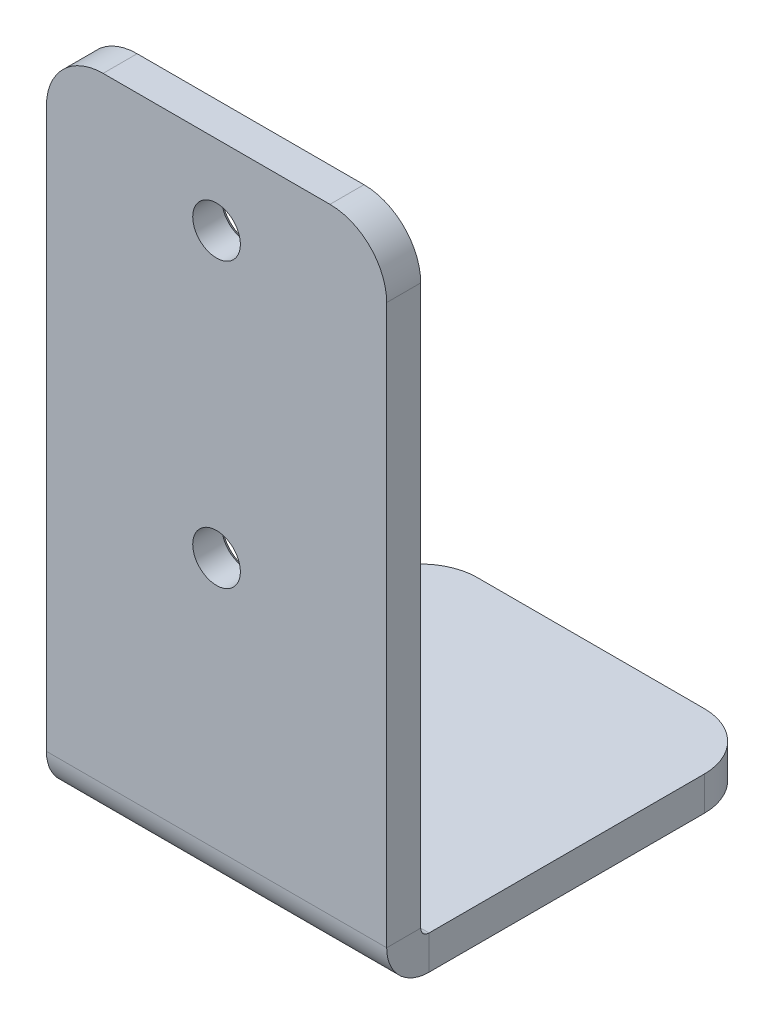
ISO-10303-21;
HEADER;
FILE_DESCRIPTION(('STEP AP214'),'2;1');
FILE_NAME('part.step','',(''),(''),'','','');
FILE_SCHEMA(('AUTOMOTIVE_DESIGN { 1 0 10303 214 1 1 1 1 }'));
ENDSEC;
DATA;
#1=APPLICATION_CONTEXT('core data for automotive mechanical design processes');
#2=APPLICATION_PROTOCOL_DEFINITION('international standard','automotive_design',2000,#1);
#3=PRODUCT_CONTEXT('',#1,'mechanical');
#4=PRODUCT('Part','Part','',(#3));
#5=PRODUCT_RELATED_PRODUCT_CATEGORY('part','',(#4));
#6=PRODUCT_DEFINITION_FORMATION('','',#4);
#7=PRODUCT_DEFINITION_CONTEXT('part definition',#1,'design');
#8=PRODUCT_DEFINITION('design','',#6,#7);
#9=PRODUCT_DEFINITION_SHAPE('','',#8);
#10=(LENGTH_UNIT() NAMED_UNIT(*) SI_UNIT(.MILLI.,.METRE.));
#11=(NAMED_UNIT(*) PLANE_ANGLE_UNIT() SI_UNIT($,.RADIAN.));
#12=(NAMED_UNIT(*) SI_UNIT($,.STERADIAN.) SOLID_ANGLE_UNIT());
#13=UNCERTAINTY_MEASURE_WITH_UNIT(LENGTH_MEASURE(1.E-05),#10,'distance_accuracy_value','');
#14=(GEOMETRIC_REPRESENTATION_CONTEXT(3) GLOBAL_UNCERTAINTY_ASSIGNED_CONTEXT((#13)) GLOBAL_UNIT_ASSIGNED_CONTEXT((#10,
#11,#12)) REPRESENTATION_CONTEXT('',''));
#15=CARTESIAN_POINT('',(0.,0.,0.));
#16=DIRECTION('',(0.,0.,1.));
#17=DIRECTION('',(1.,0.,0.));
#18=AXIS2_PLACEMENT_3D('',#15,#16,#17);
#19=CARTESIAN_POINT('',(15.,-55.,-0.7366));
#20=DIRECTION('',(1.,0.,0.));
#21=DIRECTION('',(0.,0.,-1.));
#22=AXIS2_PLACEMENT_3D('',#19,#20,#21);
#23=PLANE('',#22);
#24=DIRECTION('',(0.,-1.,0.));
#25=VECTOR('',#24,1.);
#26=CARTESIAN_POINT('',(15.,-55.,-0.7366));
#27=LINE('',#26,#25);
#28=CARTESIAN_POINT('',(15.,-55.,-0.7366));
#29=VERTEX_POINT('',#28);
#30=CARTESIAN_POINT('',(15.,-58.,-0.7366));
#31=VERTEX_POINT('',#30);
#32=EDGE_CURVE('E132',#29,#31,#27,.T.);
#33=ORIENTED_EDGE('',*,*,#32,.F.);
#34=CARTESIAN_POINT('',(15.,-54.2634,-0.7366));
#35=DIRECTION('',(-1.,0.,0.));
#36=DIRECTION('',(0.,0.,1.));
#37=AXIS2_PLACEMENT_3D('',#34,#35,#36);
#38=CIRCLE('',#37,0.7366);
#39=CARTESIAN_POINT('',(15.,-54.2634,0.));
#40=VERTEX_POINT('',#39);
#41=EDGE_CURVE('E136',#40,#29,#38,.F.);
#42=ORIENTED_EDGE('',*,*,#41,.F.);
#43=DIRECTION('',(0.,0.,-1.));
#44=VECTOR('',#43,1.);
#45=CARTESIAN_POINT('',(15.,-54.2634,3.));
#46=LINE('',#45,#44);
#47=CARTESIAN_POINT('',(15.,-54.2634,3.));
#48=VERTEX_POINT('',#47);
#49=EDGE_CURVE('E144',#48,#40,#46,.T.);
#50=ORIENTED_EDGE('',*,*,#49,.F.);
#51=CARTESIAN_POINT('',(15.,-54.2634,-0.7366));
#52=DIRECTION('',(1.,0.,0.));
#53=DIRECTION('',(0.,0.,-1.));
#54=AXIS2_PLACEMENT_3D('',#51,#52,#53);
#55=CIRCLE('',#54,3.7366);
#56=EDGE_CURVE('E138',#48,#31,#55,.T.);
#57=ORIENTED_EDGE('',*,*,#56,.T.);
#58=EDGE_LOOP('',(#33,#42,#50,#57));
#59=FACE_BOUND('',#58,.T.);
#60=ADVANCED_FACE('F41',(#59),#23,.T.);
#61=CARTESIAN_POINT('',(15.,-54.2634,3.));
#62=DIRECTION('',(1.,0.,0.));
#63=DIRECTION('',(0.,0.,-1.));
#64=AXIS2_PLACEMENT_3D('',#61,#62,#63);
#65=PLANE('',#64);
#66=DIRECTION('',(0.,0.,-1.));
#67=VECTOR('',#66,1.);
#68=CARTESIAN_POINT('',(15.,-58.,0.));
#69=LINE('',#68,#67);
#70=CARTESIAN_POINT('',(15.,-58.,-25.));
#71=VERTEX_POINT('',#70);
#72=EDGE_CURVE('E166',#31,#71,#69,.T.);
#73=ORIENTED_EDGE('',*,*,#72,.T.);
#74=DIRECTION('',(0.,-1.,0.));
#75=VECTOR('',#74,1.);
#76=CARTESIAN_POINT('',(15.,-54.2634,-25.));
#77=LINE('',#76,#75);
#78=CARTESIAN_POINT('',(15.,-55.,-25.));
#79=VERTEX_POINT('',#78);
#80=EDGE_CURVE('E165',#71,#79,#77,.F.);
#81=ORIENTED_EDGE('',*,*,#80,.T.);
#82=DIRECTION('',(0.,0.,-1.));
#83=VECTOR('',#82,1.);
#84=CARTESIAN_POINT('',(15.,-55.,0.));
#85=LINE('',#84,#83);
#86=EDGE_CURVE('E153',#29,#79,#85,.T.);
#87=ORIENTED_EDGE('',*,*,#86,.F.);
#88=ORIENTED_EDGE('',*,*,#32,.T.);
#89=EDGE_LOOP('',(#73,#81,#87,#88));
#90=FACE_BOUND('',#89,.T.);
#91=ADVANCED_FACE('F163',(#90),#65,.T.);
#92=CARTESIAN_POINT('',(-15.,-54.2634,0.));
#93=DIRECTION('',(-1.,0.,0.));
#94=DIRECTION('',(0.,0.,1.));
#95=AXIS2_PLACEMENT_3D('',#92,#93,#94);
#96=PLANE('',#95);
#97=DIRECTION('',(0.,0.,1.));
#98=VECTOR('',#97,1.);
#99=CARTESIAN_POINT('',(-15.,-54.2634,0.));
#100=LINE('',#99,#98);
#101=CARTESIAN_POINT('',(-15.,-54.2634,0.));
#102=VERTEX_POINT('',#101);
#103=CARTESIAN_POINT('',(-15.,-54.2634,3.));
#104=VERTEX_POINT('',#103);
#105=EDGE_CURVE('E211',#102,#104,#100,.T.);
#106=ORIENTED_EDGE('',*,*,#105,.F.);
#107=CARTESIAN_POINT('',(-15.,-54.2634,-0.7366));
#108=DIRECTION('',(-1.,0.,0.));
#109=DIRECTION('',(0.,0.,1.));
#110=AXIS2_PLACEMENT_3D('',#107,#108,#109);
#111=CIRCLE('',#110,0.7366);
#112=CARTESIAN_POINT('',(-15.,-55.,-0.7366));
#113=VERTEX_POINT('',#112);
#114=EDGE_CURVE('E185',#102,#113,#111,.F.);
#115=ORIENTED_EDGE('',*,*,#114,.T.);
#116=DIRECTION('',(0.,1.,0.));
#117=VECTOR('',#116,1.);
#118=CARTESIAN_POINT('',(-15.,-58.,-0.7366));
#119=LINE('',#118,#117);
#120=CARTESIAN_POINT('',(-15.,-58.,-0.7366));
#121=VERTEX_POINT('',#120);
#122=EDGE_CURVE('E209',#121,#113,#119,.T.);
#123=ORIENTED_EDGE('',*,*,#122,.F.);
#124=CARTESIAN_POINT('',(-15.,-54.2634,-0.7366));
#125=DIRECTION('',(1.,0.,0.));
#126=DIRECTION('',(0.,0.,-1.));
#127=AXIS2_PLACEMENT_3D('',#124,#125,#126);
#128=CIRCLE('',#127,3.7366);
#129=EDGE_CURVE('E191',#104,#121,#128,.T.);
#130=ORIENTED_EDGE('',*,*,#129,.F.);
#131=EDGE_LOOP('',(#106,#115,#123,#130));
#132=FACE_BOUND('',#131,.T.);
#133=ADVANCED_FACE('F311',(#132),#96,.T.);
#134=CARTESIAN_POINT('',(-15.,-58.,-0.7366));
#135=DIRECTION('',(-1.,0.,0.));
#136=DIRECTION('',(0.,0.,1.));
#137=AXIS2_PLACEMENT_3D('',#134,#135,#136);
#138=PLANE('',#137);
#139=DIRECTION('',(0.,1.,0.));
#140=VECTOR('',#139,1.);
#141=CARTESIAN_POINT('',(-15.,0.,3.));
#142=LINE('',#141,#140);
#143=CARTESIAN_POINT('',(-15.,-5.,3.));
#144=VERTEX_POINT('',#143);
#145=EDGE_CURVE('E189',#144,#104,#142,.F.);
#146=ORIENTED_EDGE('',*,*,#145,.F.);
#147=DIRECTION('',(0.,0.,-1.));
#148=VECTOR('',#147,1.);
#149=CARTESIAN_POINT('',(-15.,-5.,-0.7366));
#150=LINE('',#149,#148);
#151=CARTESIAN_POINT('',(-15.,-5.,0.));
#152=VERTEX_POINT('',#151);
#153=EDGE_CURVE('E11',#144,#152,#150,.T.);
#154=ORIENTED_EDGE('',*,*,#153,.T.);
#155=DIRECTION('',(0.,-1.,0.));
#156=VECTOR('',#155,1.);
#157=CARTESIAN_POINT('',(-15.,0.,0.));
#158=LINE('',#157,#156);
#159=EDGE_CURVE('E187',#152,#102,#158,.T.);
#160=ORIENTED_EDGE('',*,*,#159,.T.);
#161=ORIENTED_EDGE('',*,*,#105,.T.);
#162=EDGE_LOOP('',(#146,#154,#160,#161));
#163=FACE_BOUND('',#162,.T.);
#164=ADVANCED_FACE('F332',(#163),#138,.T.);
#165=CARTESIAN_POINT('',(15.,-58.,0.));
#166=DIRECTION('',(0.,1.,0.));
#167=DIRECTION('',(0.,0.,1.));
#168=AXIS2_PLACEMENT_3D('',#165,#166,#167);
#169=PLANE('',#168);
#170=DIRECTION('',(0.,0.,-1.));
#171=VECTOR('',#170,1.);
#172=CARTESIAN_POINT('',(-15.,-58.,0.));
#173=LINE('',#172,#171);
#174=CARTESIAN_POINT('',(-15.,-58.,-25.));
#175=VERTEX_POINT('',#174);
#176=EDGE_CURVE('E180',#121,#175,#173,.T.);
#177=ORIENTED_EDGE('',*,*,#176,.T.);
#178=CARTESIAN_POINT('',(-10.,-58.,-25.));
#179=DIRECTION('',(0.,1.,0.));
#180=DIRECTION('',(0.,0.,1.));
#181=AXIS2_PLACEMENT_3D('',#178,#179,#180);
#182=CIRCLE('',#181,5.);
#183=CARTESIAN_POINT('',(-10.,-58.,-30.));
#184=VERTEX_POINT('',#183);
#185=EDGE_CURVE('E228',#175,#184,#182,.F.);
#186=ORIENTED_EDGE('',*,*,#185,.T.);
#187=DIRECTION('',(-1.,0.,0.));
#188=VECTOR('',#187,1.);
#189=CARTESIAN_POINT('',(15.,-58.,-30.));
#190=LINE('',#189,#188);
#191=CARTESIAN_POINT('',(10.,-58.,-30.));
#192=VERTEX_POINT('',#191);
#193=EDGE_CURVE('E206',#192,#184,#190,.T.);
#194=ORIENTED_EDGE('',*,*,#193,.F.);
#195=CARTESIAN_POINT('',(10.,-58.,-25.));
#196=DIRECTION('',(0.,1.,0.));
#197=DIRECTION('',(0.,0.,1.));
#198=AXIS2_PLACEMENT_3D('',#195,#196,#197);
#199=CIRCLE('',#198,5.);
#200=EDGE_CURVE('E226',#192,#71,#199,.F.);
#201=ORIENTED_EDGE('',*,*,#200,.T.);
#202=ORIENTED_EDGE('',*,*,#72,.F.);
#203=DIRECTION('',(-1.,0.,0.));
#204=VECTOR('',#203,1.);
#205=CARTESIAN_POINT('',(15.,-58.,-0.7366));
#206=LINE('',#205,#204);
#207=EDGE_CURVE('E179',#31,#121,#206,.T.);
#208=ORIENTED_EDGE('',*,*,#207,.T.);
#209=EDGE_LOOP('',(#177,#186,#194,#201,#202,#208));
#210=FACE_BOUND('',#209,.T.);
#211=ADVANCED_FACE('F270',(#210),#169,.F.);
#212=CARTESIAN_POINT('',(15.,-55.,-30.));
#213=DIRECTION('',(0.,0.,-1.));
#214=DIRECTION('',(-1.,0.,0.));
#215=AXIS2_PLACEMENT_3D('',#212,#213,#214);
#216=PLANE('',#215);
#217=ORIENTED_EDGE('',*,*,#193,.T.);
#218=DIRECTION('',(0.,-1.,0.));
#219=VECTOR('',#218,1.);
#220=CARTESIAN_POINT('',(-10.,-55.,-30.));
#221=LINE('',#220,#219);
#222=CARTESIAN_POINT('',(-10.,-55.,-30.));
#223=VERTEX_POINT('',#222);
#224=EDGE_CURVE('E233',#184,#223,#221,.F.);
#225=ORIENTED_EDGE('',*,*,#224,.T.);
#226=DIRECTION('',(-1.,0.,0.));
#227=VECTOR('',#226,1.);
#228=CARTESIAN_POINT('',(15.,-55.,-30.));
#229=LINE('',#228,#227);
#230=CARTESIAN_POINT('',(10.,-55.,-30.));
#231=VERTEX_POINT('',#230);
#232=EDGE_CURVE('E160',#231,#223,#229,.T.);
#233=ORIENTED_EDGE('',*,*,#232,.F.);
#234=DIRECTION('',(0.,-1.,0.));
#235=VECTOR('',#234,1.);
#236=CARTESIAN_POINT('',(10.,-55.,-30.));
#237=LINE('',#236,#235);
#238=EDGE_CURVE('E230',#231,#192,#237,.T.);
#239=ORIENTED_EDGE('',*,*,#238,.T.);
#240=EDGE_LOOP('',(#217,#225,#233,#239));
#241=FACE_BOUND('',#240,.T.);
#242=ADVANCED_FACE('F339',(#241),#216,.T.);
#243=CARTESIAN_POINT('',(15.,-55.,0.));
#244=DIRECTION('',(0.,1.,0.));
#245=DIRECTION('',(0.,0.,1.));
#246=AXIS2_PLACEMENT_3D('',#243,#244,#245);
#247=PLANE('',#246);
#248=ORIENTED_EDGE('',*,*,#232,.T.);
#249=CARTESIAN_POINT('',(-10.,-55.,-25.));
#250=DIRECTION('',(0.,1.,0.));
#251=DIRECTION('',(0.,0.,1.));
#252=AXIS2_PLACEMENT_3D('',#249,#250,#251);
#253=CIRCLE('',#252,5.);
#254=CARTESIAN_POINT('',(-15.,-55.,-25.));
#255=VERTEX_POINT('',#254);
#256=EDGE_CURVE('E237',#223,#255,#253,.T.);
#257=ORIENTED_EDGE('',*,*,#256,.T.);
#258=DIRECTION('',(0.,0.,-1.));
#259=VECTOR('',#258,1.);
#260=CARTESIAN_POINT('',(-15.,-55.,0.));
#261=LINE('',#260,#259);
#262=EDGE_CURVE('E156',#113,#255,#261,.T.);
#263=ORIENTED_EDGE('',*,*,#262,.F.);
#264=DIRECTION('',(-1.,0.,0.));
#265=VECTOR('',#264,1.);
#266=CARTESIAN_POINT('',(15.,-55.,-0.7366));
#267=LINE('',#266,#265);
#268=EDGE_CURVE('E150',#29,#113,#267,.T.);
#269=ORIENTED_EDGE('',*,*,#268,.F.);
#270=ORIENTED_EDGE('',*,*,#86,.T.);
#271=CARTESIAN_POINT('',(10.,-55.,-25.));
#272=DIRECTION('',(0.,1.,0.));
#273=DIRECTION('',(0.,0.,1.));
#274=AXIS2_PLACEMENT_3D('',#271,#272,#273);
#275=CIRCLE('',#274,5.);
#276=EDGE_CURVE('E235',#79,#231,#275,.T.);
#277=ORIENTED_EDGE('',*,*,#276,.T.);
#278=EDGE_LOOP('',(#248,#257,#263,#269,#270,#277));
#279=FACE_BOUND('',#278,.T.);
#280=ADVANCED_FACE('F152',(#279),#247,.T.);
#281=CARTESIAN_POINT('',(15.,-54.2634,-0.7366));
#282=DIRECTION('',(-1.,0.,0.));
#283=DIRECTION('',(0.,0.,1.));
#284=AXIS2_PLACEMENT_3D('',#281,#282,#283);
#285=CYLINDRICAL_SURFACE('',#284,0.7366);
#286=ORIENTED_EDGE('',*,*,#114,.F.);
#287=DIRECTION('',(-1.,0.,0.));
#288=VECTOR('',#287,1.);
#289=CARTESIAN_POINT('',(15.,-54.2634,0.));
#290=LINE('',#289,#288);
#291=EDGE_CURVE('E161',#40,#102,#290,.T.);
#292=ORIENTED_EDGE('',*,*,#291,.F.);
#293=ORIENTED_EDGE('',*,*,#41,.T.);
#294=ORIENTED_EDGE('',*,*,#268,.T.);
#295=EDGE_LOOP('',(#286,#292,#293,#294));
#296=FACE_BOUND('',#295,.T.);
#297=ADVANCED_FACE('F169',(#296),#285,.F.);
#298=CARTESIAN_POINT('',(15.,0.,0.));
#299=DIRECTION('',(0.,0.,-1.));
#300=DIRECTION('',(-1.,0.,0.));
#301=AXIS2_PLACEMENT_3D('',#298,#299,#300);
#302=PLANE('',#301);
#303=CARTESIAN_POINT('',(0.,-32.,0.));
#304=DIRECTION('',(0.,0.,-1.));
#305=DIRECTION('',(-1.,0.,0.));
#306=AXIS2_PLACEMENT_3D('',#303,#304,#305);
#307=CIRCLE('',#306,2.525);
#308=CARTESIAN_POINT('',(-2.525,-32.,0.));
#309=VERTEX_POINT('',#308);
#310=EDGE_CURVE('E279',#309,#309,#307,.T.);
#311=ORIENTED_EDGE('',*,*,#310,.F.);
#312=EDGE_LOOP('',(#311));
#313=FACE_BOUND('',#312,.T.);
#314=CARTESIAN_POINT('',(0.,-7.,0.));
#315=DIRECTION('',(0.,0.,-1.));
#316=DIRECTION('',(-1.,0.,0.));
#317=AXIS2_PLACEMENT_3D('',#314,#315,#316);
#318=CIRCLE('',#317,2.525);
#319=CARTESIAN_POINT('',(-2.525,-7.,0.));
#320=VERTEX_POINT('',#319);
#321=EDGE_CURVE('E222',#320,#320,#318,.T.);
#322=ORIENTED_EDGE('',*,*,#321,.F.);
#323=EDGE_LOOP('',(#322));
#324=FACE_BOUND('',#323,.T.);
#325=DIRECTION('',(-1.,0.,0.));
#326=VECTOR('',#325,1.);
#327=CARTESIAN_POINT('',(15.,0.,0.));
#328=LINE('',#327,#326);
#329=CARTESIAN_POINT('',(10.,0.,0.));
#330=VERTEX_POINT('',#329);
#331=CARTESIAN_POINT('',(-10.,0.,0.));
#332=VERTEX_POINT('',#331);
#333=EDGE_CURVE('E201',#330,#332,#328,.T.);
#334=ORIENTED_EDGE('',*,*,#333,.F.);
#335=CARTESIAN_POINT('',(10.,-5.,0.));
#336=DIRECTION('',(0.,0.,-1.));
#337=DIRECTION('',(-1.,0.,0.));
#338=AXIS2_PLACEMENT_3D('',#335,#336,#337);
#339=CIRCLE('',#338,5.);
#340=CARTESIAN_POINT('',(15.,-5.,0.));
#341=VERTEX_POINT('',#340);
#342=EDGE_CURVE('E247',#330,#341,#339,.T.);
#343=ORIENTED_EDGE('',*,*,#342,.T.);
#344=DIRECTION('',(0.,-1.,0.));
#345=VECTOR('',#344,1.);
#346=CARTESIAN_POINT('',(15.,0.,0.));
#347=LINE('',#346,#345);
#348=EDGE_CURVE('E171',#341,#40,#347,.T.);
#349=ORIENTED_EDGE('',*,*,#348,.T.);
#350=ORIENTED_EDGE('',*,*,#291,.T.);
#351=ORIENTED_EDGE('',*,*,#159,.F.);
#352=CARTESIAN_POINT('',(-10.,-5.,0.));
#353=DIRECTION('',(0.,0.,-1.));
#354=DIRECTION('',(-1.,0.,0.));
#355=AXIS2_PLACEMENT_3D('',#352,#353,#354);
#356=CIRCLE('',#355,5.);
#357=EDGE_CURVE('E245',#152,#332,#356,.T.);
#358=ORIENTED_EDGE('',*,*,#357,.T.);
#359=EDGE_LOOP('',(#334,#343,#349,#350,#351,#358));
#360=FACE_BOUND('',#359,.T.);
#361=ADVANCED_FACE('F262',(#313,#324,#360),#302,.T.);
#362=CARTESIAN_POINT('',(15.,0.,3.));
#363=DIRECTION('',(0.,1.,0.));
#364=DIRECTION('',(0.,0.,1.));
#365=AXIS2_PLACEMENT_3D('',#362,#363,#364);
#366=PLANE('',#365);
#367=DIRECTION('',(-1.,0.,0.));
#368=VECTOR('',#367,1.);
#369=CARTESIAN_POINT('',(15.,0.,3.));
#370=LINE('',#369,#368);
#371=CARTESIAN_POINT('',(10.,0.,3.));
#372=VERTEX_POINT('',#371);
#373=CARTESIAN_POINT('',(-10.,0.,3.));
#374=VERTEX_POINT('',#373);
#375=EDGE_CURVE('E199',#372,#374,#370,.T.);
#376=ORIENTED_EDGE('',*,*,#375,.F.);
#377=DIRECTION('',(0.,0.,-1.));
#378=VECTOR('',#377,1.);
#379=CARTESIAN_POINT('',(10.,0.,0.));
#380=LINE('',#379,#378);
#381=EDGE_CURVE('E242',#372,#330,#380,.T.);
#382=ORIENTED_EDGE('',*,*,#381,.T.);
#383=ORIENTED_EDGE('',*,*,#333,.T.);
#384=DIRECTION('',(0.,0.,-1.));
#385=VECTOR('',#384,1.);
#386=CARTESIAN_POINT('',(-10.,0.,3.));
#387=LINE('',#386,#385);
#388=EDGE_CURVE('E240',#332,#374,#387,.F.);
#389=ORIENTED_EDGE('',*,*,#388,.T.);
#390=EDGE_LOOP('',(#376,#382,#383,#389));
#391=FACE_BOUND('',#390,.T.);
#392=ADVANCED_FACE('F257',(#391),#366,.T.);
#393=CARTESIAN_POINT('',(15.,0.,3.));
#394=DIRECTION('',(0.,0.,-1.));
#395=DIRECTION('',(-1.,0.,0.));
#396=AXIS2_PLACEMENT_3D('',#393,#394,#395);
#397=PLANE('',#396);
#398=CARTESIAN_POINT('',(0.,-32.,3.));
#399=DIRECTION('',(0.,0.,-1.));
#400=DIRECTION('',(-1.,0.,0.));
#401=AXIS2_PLACEMENT_3D('',#398,#399,#400);
#402=CIRCLE('',#401,2.09999999999999);
#403=CARTESIAN_POINT('',(-2.09999999999999,-32.,3.));
#404=VERTEX_POINT('',#403);
#405=EDGE_CURVE('E219',#404,#404,#402,.T.);
#406=ORIENTED_EDGE('',*,*,#405,.T.);
#407=EDGE_LOOP('',(#406));
#408=FACE_BOUND('',#407,.T.);
#409=CARTESIAN_POINT('',(0.,-7.,3.));
#410=DIRECTION('',(0.,0.,-1.));
#411=DIRECTION('',(-1.,0.,0.));
#412=AXIS2_PLACEMENT_3D('',#409,#410,#411);
#413=CIRCLE('',#412,2.09999999999999);
#414=CARTESIAN_POINT('',(-2.09999999999998,-7.,3.));
#415=VERTEX_POINT('',#414);
#416=EDGE_CURVE('E183',#415,#415,#413,.T.);
#417=ORIENTED_EDGE('',*,*,#416,.T.);
#418=EDGE_LOOP('',(#417));
#419=FACE_BOUND('',#418,.T.);
#420=DIRECTION('',(0.,1.,0.));
#421=VECTOR('',#420,1.);
#422=CARTESIAN_POINT('',(15.,0.,3.));
#423=LINE('',#422,#421);
#424=CARTESIAN_POINT('',(15.,-5.,3.));
#425=VERTEX_POINT('',#424);
#426=EDGE_CURVE('E173',#425,#48,#423,.F.);
#427=ORIENTED_EDGE('',*,*,#426,.F.);
#428=CARTESIAN_POINT('',(10.,-5.,3.));
#429=DIRECTION('',(0.,0.,-1.));
#430=DIRECTION('',(-1.,0.,0.));
#431=AXIS2_PLACEMENT_3D('',#428,#429,#430);
#432=CIRCLE('',#431,5.);
#433=EDGE_CURVE('E49',#425,#372,#432,.F.);
#434=ORIENTED_EDGE('',*,*,#433,.T.);
#435=ORIENTED_EDGE('',*,*,#375,.T.);
#436=CARTESIAN_POINT('',(-10.,-5.,3.));
#437=DIRECTION('',(0.,0.,-1.));
#438=DIRECTION('',(-1.,0.,0.));
#439=AXIS2_PLACEMENT_3D('',#436,#437,#438);
#440=CIRCLE('',#439,5.);
#441=EDGE_CURVE('E56',#374,#144,#440,.F.);
#442=ORIENTED_EDGE('',*,*,#441,.T.);
#443=ORIENTED_EDGE('',*,*,#145,.T.);
#444=DIRECTION('',(-1.,0.,0.));
#445=VECTOR('',#444,1.);
#446=CARTESIAN_POINT('',(15.,-54.2634,3.));
#447=LINE('',#446,#445);
#448=EDGE_CURVE('E196',#48,#104,#447,.T.);
#449=ORIENTED_EDGE('',*,*,#448,.F.);
#450=EDGE_LOOP('',(#427,#434,#435,#442,#443,#449));
#451=FACE_BOUND('',#450,.T.);
#452=ADVANCED_FACE('F252',(#408,#419,#451),#397,.F.);
#453=CARTESIAN_POINT('',(15.,-54.2634,-0.7366));
#454=DIRECTION('',(-1.,0.,0.));
#455=DIRECTION('',(0.,0.,1.));
#456=AXIS2_PLACEMENT_3D('',#453,#454,#455);
#457=CYLINDRICAL_SURFACE('',#456,3.7366);
#458=ORIENTED_EDGE('',*,*,#129,.T.);
#459=ORIENTED_EDGE('',*,*,#207,.F.);
#460=ORIENTED_EDGE('',*,*,#56,.F.);
#461=ORIENTED_EDGE('',*,*,#448,.T.);
#462=EDGE_LOOP('',(#458,#459,#460,#461));
#463=FACE_BOUND('',#462,.T.);
#464=ADVANCED_FACE('F266',(#463),#457,.T.);
#465=CARTESIAN_POINT('',(15.,-54.2634,-0.7366));
#466=DIRECTION('',(-1.,0.,0.));
#467=DIRECTION('',(0.,0.,1.));
#468=AXIS2_PLACEMENT_3D('',#465,#466,#467);
#469=PLANE('',#468);
#470=ORIENTED_EDGE('',*,*,#348,.F.);
#471=DIRECTION('',(0.,0.,-1.));
#472=VECTOR('',#471,1.);
#473=CARTESIAN_POINT('',(15.,-5.,3.));
#474=LINE('',#473,#472);
#475=EDGE_CURVE('E64',#341,#425,#474,.F.);
#476=ORIENTED_EDGE('',*,*,#475,.T.);
#477=ORIENTED_EDGE('',*,*,#426,.T.);
#478=ORIENTED_EDGE('',*,*,#49,.T.);
#479=EDGE_LOOP('',(#470,#476,#477,#478));
#480=FACE_BOUND('',#479,.T.);
#481=ADVANCED_FACE('F263',(#480),#469,.F.);
#482=CARTESIAN_POINT('',(-15.,-54.2634,-0.7366));
#483=DIRECTION('',(-1.,0.,0.));
#484=DIRECTION('',(0.,0.,1.));
#485=AXIS2_PLACEMENT_3D('',#482,#483,#484);
#486=PLANE('',#485);
#487=ORIENTED_EDGE('',*,*,#262,.T.);
#488=DIRECTION('',(0.,-1.,0.));
#489=VECTOR('',#488,1.);
#490=CARTESIAN_POINT('',(-15.,-54.2634,-25.));
#491=LINE('',#490,#489);
#492=EDGE_CURVE('E143',#255,#175,#491,.T.);
#493=ORIENTED_EDGE('',*,*,#492,.T.);
#494=ORIENTED_EDGE('',*,*,#176,.F.);
#495=ORIENTED_EDGE('',*,*,#122,.T.);
#496=EDGE_LOOP('',(#487,#493,#494,#495));
#497=FACE_BOUND('',#496,.T.);
#498=ADVANCED_FACE('F302',(#497),#486,.T.);
#499=CARTESIAN_POINT('',(0.,-7.,0.));
#500=DIRECTION('',(0.,0.,-1.));
#501=DIRECTION('',(-1.,0.,0.));
#502=AXIS2_PLACEMENT_3D('',#499,#500,#501);
#503=CYLINDRICAL_SURFACE('',#502,2.09999999999999);
#504=CARTESIAN_POINT('',(0.,-7.,0.424999999999995));
#505=DIRECTION('',(0.,0.,-1.));
#506=DIRECTION('',(-1.,0.,0.));
#507=AXIS2_PLACEMENT_3D('',#504,#505,#506);
#508=CIRCLE('',#507,2.09999999999999);
#509=CARTESIAN_POINT('',(-2.09999999999999,-7.,0.424999999999995));
#510=VERTEX_POINT('',#509);
#511=EDGE_CURVE('E218',#510,#510,#508,.T.);
#512=ORIENTED_EDGE('',*,*,#511,.T.);
#513=EDGE_LOOP('',(#512));
#514=FACE_BOUND('',#513,.T.);
#515=ORIENTED_EDGE('',*,*,#416,.F.);
#516=EDGE_LOOP('',(#515));
#517=FACE_BOUND('',#516,.T.);
#518=ADVANCED_FACE('F293',(#514,#517),#503,.F.);
#519=CARTESIAN_POINT('',(0.,-7.,0.));
#520=DIRECTION('',(0.,0.,-1.));
#521=DIRECTION('',(-1.,0.,0.));
#522=AXIS2_PLACEMENT_3D('',#519,#520,#521);
#523=CONICAL_SURFACE('',#522,2.525,0.785398163397465);
#524=ORIENTED_EDGE('',*,*,#511,.F.);
#525=EDGE_LOOP('',(#524));
#526=FACE_BOUND('',#525,.T.);
#527=ORIENTED_EDGE('',*,*,#321,.T.);
#528=EDGE_LOOP('',(#527));
#529=FACE_BOUND('',#528,.T.);
#530=ADVANCED_FACE('F290',(#526,#529),#523,.F.);
#531=CARTESIAN_POINT('',(0.,-32.,0.));
#532=DIRECTION('',(0.,0.,-1.));
#533=DIRECTION('',(-1.,0.,0.));
#534=AXIS2_PLACEMENT_3D('',#531,#532,#533);
#535=CYLINDRICAL_SURFACE('',#534,2.09999999999999);
#536=CARTESIAN_POINT('',(0.,-32.,0.424999999999995));
#537=DIRECTION('',(0.,0.,-1.));
#538=DIRECTION('',(-1.,0.,0.));
#539=AXIS2_PLACEMENT_3D('',#536,#537,#538);
#540=CIRCLE('',#539,2.09999999999999);
#541=CARTESIAN_POINT('',(-2.09999999999999,-32.,0.424999999999995));
#542=VERTEX_POINT('',#541);
#543=EDGE_CURVE('E223',#542,#542,#540,.T.);
#544=ORIENTED_EDGE('',*,*,#543,.T.);
#545=EDGE_LOOP('',(#544));
#546=FACE_BOUND('',#545,.T.);
#547=ORIENTED_EDGE('',*,*,#405,.F.);
#548=EDGE_LOOP('',(#547));
#549=FACE_BOUND('',#548,.T.);
#550=ADVANCED_FACE('F292',(#546,#549),#535,.F.);
#551=CARTESIAN_POINT('',(0.,-32.,0.));
#552=DIRECTION('',(0.,0.,-1.));
#553=DIRECTION('',(-1.,0.,0.));
#554=AXIS2_PLACEMENT_3D('',#551,#552,#553);
#555=CONICAL_SURFACE('',#554,2.525,0.785398163397465);
#556=ORIENTED_EDGE('',*,*,#543,.F.);
#557=EDGE_LOOP('',(#556));
#558=FACE_BOUND('',#557,.T.);
#559=ORIENTED_EDGE('',*,*,#310,.T.);
#560=EDGE_LOOP('',(#559));
#561=FACE_BOUND('',#560,.T.);
#562=ADVANCED_FACE('F283',(#558,#561),#555,.F.);
#563=CARTESIAN_POINT('',(-10.,-54.2634,-25.));
#564=DIRECTION('',(0.,-1.,0.));
#565=DIRECTION('',(0.,0.,-1.));
#566=AXIS2_PLACEMENT_3D('',#563,#564,#565);
#567=CYLINDRICAL_SURFACE('',#566,5.);
#568=ORIENTED_EDGE('',*,*,#256,.F.);
#569=ORIENTED_EDGE('',*,*,#224,.F.);
#570=ORIENTED_EDGE('',*,*,#185,.F.);
#571=ORIENTED_EDGE('',*,*,#492,.F.);
#572=EDGE_LOOP('',(#568,#569,#570,#571));
#573=FACE_BOUND('',#572,.T.);
#574=ADVANCED_FACE('F315',(#573),#567,.T.);
#575=CARTESIAN_POINT('',(10.,-55.,-25.));
#576=DIRECTION('',(0.,-1.,0.));
#577=DIRECTION('',(0.,0.,-1.));
#578=AXIS2_PLACEMENT_3D('',#575,#576,#577);
#579=CYLINDRICAL_SURFACE('',#578,5.);
#580=ORIENTED_EDGE('',*,*,#276,.F.);
#581=ORIENTED_EDGE('',*,*,#80,.F.);
#582=ORIENTED_EDGE('',*,*,#200,.F.);
#583=ORIENTED_EDGE('',*,*,#238,.F.);
#584=EDGE_LOOP('',(#580,#581,#582,#583));
#585=FACE_BOUND('',#584,.T.);
#586=ADVANCED_FACE('F318',(#585),#579,.T.);
#587=CARTESIAN_POINT('',(10.,-5.,3.));
#588=DIRECTION('',(0.,0.,1.));
#589=DIRECTION('',(1.,0.,0.));
#590=AXIS2_PLACEMENT_3D('',#587,#588,#589);
#591=CYLINDRICAL_SURFACE('',#590,5.);
#592=ORIENTED_EDGE('',*,*,#433,.F.);
#593=ORIENTED_EDGE('',*,*,#475,.F.);
#594=ORIENTED_EDGE('',*,*,#342,.F.);
#595=ORIENTED_EDGE('',*,*,#381,.F.);
#596=EDGE_LOOP('',(#592,#593,#594,#595));
#597=FACE_BOUND('',#596,.T.);
#598=ADVANCED_FACE('F260',(#597),#591,.T.);
#599=CARTESIAN_POINT('',(-10.,-5.,-0.7366));
#600=DIRECTION('',(0.,0.,-1.));
#601=DIRECTION('',(-1.,0.,0.));
#602=AXIS2_PLACEMENT_3D('',#599,#600,#601);
#603=CYLINDRICAL_SURFACE('',#602,5.);
#604=ORIENTED_EDGE('',*,*,#441,.F.);
#605=ORIENTED_EDGE('',*,*,#388,.F.);
#606=ORIENTED_EDGE('',*,*,#357,.F.);
#607=ORIENTED_EDGE('',*,*,#153,.F.);
#608=EDGE_LOOP('',(#604,#605,#606,#607));
#609=FACE_BOUND('',#608,.T.);
#610=ADVANCED_FACE('F43',(#609),#603,.T.);
#611=CLOSED_SHELL('',(#60,#91,#133,#164,#211,#242,#280,#297,#361,#392,#452,#464,#481,#498,#518,
#530,#550,#562,#574,#586,#598,#610));
#612=MANIFOLD_SOLID_BREP('B2',#611);
#613=ADVANCED_BREP_SHAPE_REPRESENTATION('',(#18,#612),#14);
#614=SHAPE_DEFINITION_REPRESENTATION(#9,#613);
ENDSEC;
END-ISO-10303-21;
